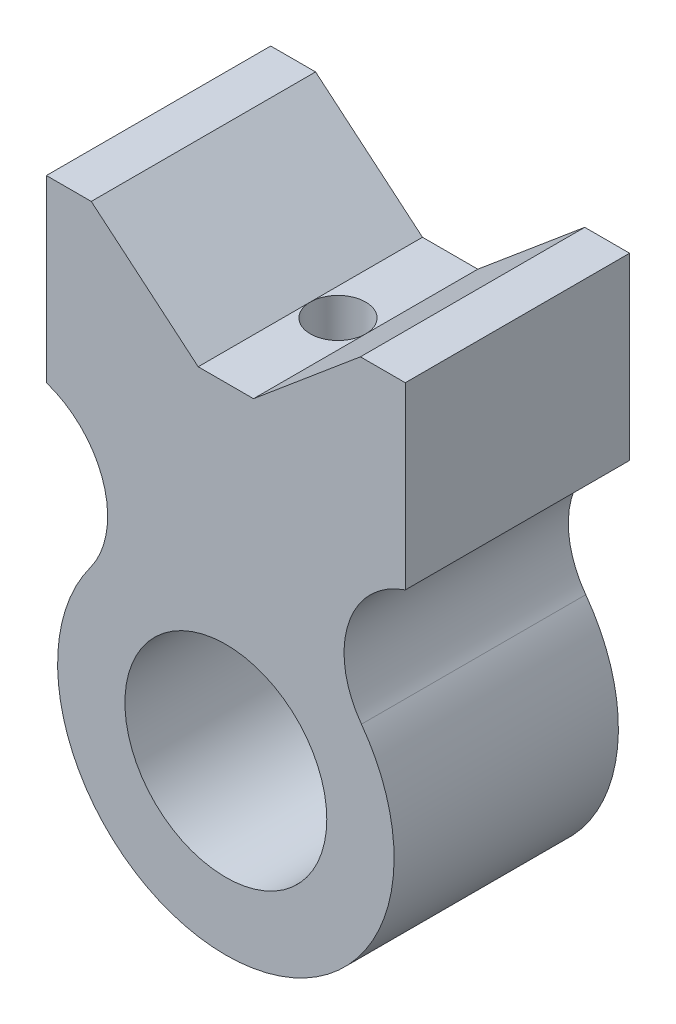
ISO-10303-21;
HEADER;
FILE_DESCRIPTION(('STEP AP214'),'2;1');
FILE_NAME('part.step','',(''),(''),'','','');
FILE_SCHEMA(('AUTOMOTIVE_DESIGN { 1 0 10303 214 1 1 1 1 }'));
ENDSEC;
DATA;
#1=APPLICATION_CONTEXT('core data for automotive mechanical design processes');
#2=APPLICATION_PROTOCOL_DEFINITION('international standard','automotive_design',2000,#1);
#3=PRODUCT_CONTEXT('',#1,'mechanical');
#4=PRODUCT('Part','Part','',(#3));
#5=PRODUCT_RELATED_PRODUCT_CATEGORY('part','',(#4));
#6=PRODUCT_DEFINITION_FORMATION('','',#4);
#7=PRODUCT_DEFINITION_CONTEXT('part definition',#1,'design');
#8=PRODUCT_DEFINITION('design','',#6,#7);
#9=PRODUCT_DEFINITION_SHAPE('','',#8);
#10=(LENGTH_UNIT() NAMED_UNIT(*) SI_UNIT(.MILLI.,.METRE.));
#11=(NAMED_UNIT(*) PLANE_ANGLE_UNIT() SI_UNIT($,.RADIAN.));
#12=(NAMED_UNIT(*) SI_UNIT($,.STERADIAN.) SOLID_ANGLE_UNIT());
#13=UNCERTAINTY_MEASURE_WITH_UNIT(LENGTH_MEASURE(1.E-05),#10,'distance_accuracy_value','');
#14=(GEOMETRIC_REPRESENTATION_CONTEXT(3) GLOBAL_UNCERTAINTY_ASSIGNED_CONTEXT((#13)) GLOBAL_UNIT_ASSIGNED_CONTEXT((#10,
#11,#12)) REPRESENTATION_CONTEXT('',''));
#15=CARTESIAN_POINT('',(0.,0.,0.));
#16=DIRECTION('',(0.,0.,1.));
#17=DIRECTION('',(1.,0.,0.));
#18=AXIS2_PLACEMENT_3D('',#15,#16,#17);
#19=CARTESIAN_POINT('',(-6.16492814811606,73.,-25.));
#20=DIRECTION('',(0.,1.,0.));
#21=DIRECTION('',(0.,0.,1.));
#22=AXIS2_PLACEMENT_3D('',#19,#20,#21);
#23=PLANE('',#22);
#24=CARTESIAN_POINT('',(0.,73.,0.));
#25=DIRECTION('',(0.,1.,0.));
#26=DIRECTION('',(0.,0.,1.));
#27=AXIS2_PLACEMENT_3D('',#24,#25,#26);
#28=CIRCLE('',#27,6.16492814811606);
#29=CARTESIAN_POINT('',(6.16492814811606,73.,0.));
#30=VERTEX_POINT('',#29);
#31=CARTESIAN_POINT('',(-6.16492814811606,73.,0.));
#32=VERTEX_POINT('',#31);
#33=EDGE_CURVE('E62',#30,#32,#28,.T.);
#34=ORIENTED_EDGE('',*,*,#33,.F.);
#35=DIRECTION('',(0.,0.,1.));
#36=VECTOR('',#35,1.);
#37=CARTESIAN_POINT('',(6.16492814811606,73.,-25.));
#38=LINE('',#37,#36);
#39=CARTESIAN_POINT('',(6.16492814811606,73.,-25.));
#40=VERTEX_POINT('',#39);
#41=EDGE_CURVE('E140',#40,#30,#38,.T.);
#42=ORIENTED_EDGE('',*,*,#41,.F.);
#43=DIRECTION('',(-1.,0.,0.));
#44=VECTOR('',#43,1.);
#45=CARTESIAN_POINT('',(-6.16492814811606,73.,-25.));
#46=LINE('',#45,#44);
#47=CARTESIAN_POINT('',(-6.16492814811606,73.,-25.));
#48=VERTEX_POINT('',#47);
#49=EDGE_CURVE('E249',#40,#48,#46,.T.);
#50=ORIENTED_EDGE('',*,*,#49,.T.);
#51=DIRECTION('',(0.,0.,1.));
#52=VECTOR('',#51,1.);
#53=CARTESIAN_POINT('',(-6.16492814811606,73.,-25.));
#54=LINE('',#53,#52);
#55=EDGE_CURVE('E142',#48,#32,#54,.T.);
#56=ORIENTED_EDGE('',*,*,#55,.T.);
#57=EDGE_LOOP('',(#34,#42,#50,#56));
#58=FACE_BOUND('',#57,.T.);
#59=ADVANCED_FACE('F45',(#58),#23,.T.);
#60=CARTESIAN_POINT('',(-46.3461684635963,34.0335521029462,-25.));
#61=DIRECTION('',(0.,0.,1.));
#62=DIRECTION('',(1.,0.,0.));
#63=AXIS2_PLACEMENT_3D('',#60,#61,#62);
#64=CYLINDRICAL_SURFACE('',#63,20.);
#65=DIRECTION('',(0.,0.,1.));
#66=VECTOR('',#65,1.);
#67=CARTESIAN_POINT('',(-30.2257620414758,22.1957948497475,-25.));
#68=LINE('',#67,#66);
#69=CARTESIAN_POINT('',(-30.2257620414758,22.1957948497475,-25.));
#70=VERTEX_POINT('',#69);
#71=CARTESIAN_POINT('',(-30.2257620414758,22.1957948497475,25.));
#72=VERTEX_POINT('',#71);
#73=EDGE_CURVE('E49',#70,#72,#68,.T.);
#74=ORIENTED_EDGE('',*,*,#73,.T.);
#75=CARTESIAN_POINT('',(-46.3461684635963,34.0335521029462,25.));
#76=DIRECTION('',(0.,0.,-1.));
#77=DIRECTION('',(1.,0.,0.));
#78=AXIS2_PLACEMENT_3D('',#75,#76,#77);
#79=CIRCLE('',#78,20.);
#80=CARTESIAN_POINT('',(-40.,53.,25.));
#81=VERTEX_POINT('',#80);
#82=EDGE_CURVE('E304',#81,#72,#79,.T.);
#83=ORIENTED_EDGE('',*,*,#82,.F.);
#84=DIRECTION('',(0.,0.,1.));
#85=VECTOR('',#84,1.);
#86=CARTESIAN_POINT('',(-40.,53.,-25.));
#87=LINE('',#86,#85);
#88=CARTESIAN_POINT('',(-40.,53.,-25.));
#89=VERTEX_POINT('',#88);
#90=EDGE_CURVE('E11',#89,#81,#87,.T.);
#91=ORIENTED_EDGE('',*,*,#90,.F.);
#92=CARTESIAN_POINT('',(-46.3461684635963,34.0335521029462,-25.));
#93=DIRECTION('',(0.,0.,-1.));
#94=DIRECTION('',(1.,0.,0.));
#95=AXIS2_PLACEMENT_3D('',#92,#93,#94);
#96=CIRCLE('',#95,20.);
#97=EDGE_CURVE('E229',#89,#70,#96,.T.);
#98=ORIENTED_EDGE('',*,*,#97,.T.);
#99=EDGE_LOOP('',(#74,#83,#91,#98));
#100=FACE_BOUND('',#99,.T.);
#101=ADVANCED_FACE('F47',(#100),#64,.F.);
#102=CARTESIAN_POINT('',(-40.,53.,-25.));
#103=DIRECTION('',(-1.,0.,0.));
#104=DIRECTION('',(0.,-1.,0.));
#105=AXIS2_PLACEMENT_3D('',#102,#103,#104);
#106=PLANE('',#105);
#107=ORIENTED_EDGE('',*,*,#90,.T.);
#108=DIRECTION('',(0.,-1.,0.));
#109=VECTOR('',#108,1.);
#110=CARTESIAN_POINT('',(-40.,53.,25.));
#111=LINE('',#110,#109);
#112=CARTESIAN_POINT('',(-40.,93.,25.));
#113=VERTEX_POINT('',#112);
#114=EDGE_CURVE('E219',#113,#81,#111,.T.);
#115=ORIENTED_EDGE('',*,*,#114,.F.);
#116=DIRECTION('',(0.,0.,1.));
#117=VECTOR('',#116,1.);
#118=CARTESIAN_POINT('',(-40.,93.,-25.));
#119=LINE('',#118,#117);
#120=CARTESIAN_POINT('',(-40.,93.,-25.));
#121=VERTEX_POINT('',#120);
#122=EDGE_CURVE('E55',#121,#113,#119,.T.);
#123=ORIENTED_EDGE('',*,*,#122,.F.);
#124=DIRECTION('',(0.,-1.,0.));
#125=VECTOR('',#124,1.);
#126=CARTESIAN_POINT('',(-40.,53.,-25.));
#127=LINE('',#126,#125);
#128=EDGE_CURVE('E180',#121,#89,#127,.T.);
#129=ORIENTED_EDGE('',*,*,#128,.T.);
#130=EDGE_LOOP('',(#107,#115,#123,#129));
#131=FACE_BOUND('',#130,.T.);
#132=ADVANCED_FACE('F258',(#131),#106,.T.);
#133=CARTESIAN_POINT('',(-40.,93.,-25.));
#134=DIRECTION('',(0.,1.,0.));
#135=DIRECTION('',(0.,0.,1.));
#136=AXIS2_PLACEMENT_3D('',#133,#134,#135);
#137=PLANE('',#136);
#138=ORIENTED_EDGE('',*,*,#122,.T.);
#139=DIRECTION('',(-1.,0.,0.));
#140=VECTOR('',#139,1.);
#141=CARTESIAN_POINT('',(-40.,93.,25.));
#142=LINE('',#141,#140);
#143=CARTESIAN_POINT('',(-30.,93.,25.));
#144=VERTEX_POINT('',#143);
#145=EDGE_CURVE('E213',#144,#113,#142,.T.);
#146=ORIENTED_EDGE('',*,*,#145,.F.);
#147=DIRECTION('',(0.,0.,1.));
#148=VECTOR('',#147,1.);
#149=CARTESIAN_POINT('',(-30.,93.,-25.));
#150=LINE('',#149,#148);
#151=CARTESIAN_POINT('',(-30.,93.,-25.));
#152=VERTEX_POINT('',#151);
#153=EDGE_CURVE('E194',#152,#144,#150,.T.);
#154=ORIENTED_EDGE('',*,*,#153,.F.);
#155=DIRECTION('',(-1.,0.,0.));
#156=VECTOR('',#155,1.);
#157=CARTESIAN_POINT('',(-40.,93.,-25.));
#158=LINE('',#157,#156);
#159=EDGE_CURVE('E183',#152,#121,#158,.T.);
#160=ORIENTED_EDGE('',*,*,#159,.T.);
#161=EDGE_LOOP('',(#138,#146,#154,#160));
#162=FACE_BOUND('',#161,.T.);
#163=ADVANCED_FACE('F217',(#162),#137,.T.);
#164=CARTESIAN_POINT('',(-30.,93.,-25.));
#165=DIRECTION('',(0.642787609686544,0.766044443118974,0.));
#166=DIRECTION('',(-0.766044443118974,0.642787609686544,0.));
#167=AXIS2_PLACEMENT_3D('',#164,#165,#166);
#168=PLANE('',#167);
#169=ORIENTED_EDGE('',*,*,#153,.T.);
#170=DIRECTION('',(-0.766044443118974,0.642787609686543,0.));
#171=VECTOR('',#170,1.);
#172=CARTESIAN_POINT('',(-30.,93.,25.));
#173=LINE('',#172,#171);
#174=CARTESIAN_POINT('',(-6.16492814811606,73.,25.));
#175=VERTEX_POINT('',#174);
#176=EDGE_CURVE('E202',#175,#144,#173,.T.);
#177=ORIENTED_EDGE('',*,*,#176,.F.);
#178=EDGE_CURVE('E161',#32,#175,#54,.T.);
#179=ORIENTED_EDGE('',*,*,#178,.F.);
#180=ORIENTED_EDGE('',*,*,#55,.F.);
#181=DIRECTION('',(-0.766044443118974,0.642787609686543,0.));
#182=VECTOR('',#181,1.);
#183=CARTESIAN_POINT('',(-30.,93.,-25.));
#184=LINE('',#183,#182);
#185=EDGE_CURVE('E189',#48,#152,#184,.T.);
#186=ORIENTED_EDGE('',*,*,#185,.T.);
#187=EDGE_LOOP('',(#169,#177,#179,#180,#186));
#188=FACE_BOUND('',#187,.T.);
#189=ADVANCED_FACE('F201',(#188),#168,.T.);
#190=EDGE_CURVE('E127',#32,#30,#28,.T.);
#191=ORIENTED_EDGE('',*,*,#190,.F.);
#192=ORIENTED_EDGE('',*,*,#178,.T.);
#193=DIRECTION('',(-1.,0.,0.));
#194=VECTOR('',#193,1.);
#195=CARTESIAN_POINT('',(-6.16492814811606,73.,25.));
#196=LINE('',#195,#194);
#197=CARTESIAN_POINT('',(6.16492814811606,73.,25.));
#198=VERTEX_POINT('',#197);
#199=EDGE_CURVE('E149',#198,#175,#196,.T.);
#200=ORIENTED_EDGE('',*,*,#199,.F.);
#201=EDGE_CURVE('E146',#30,#198,#38,.T.);
#202=ORIENTED_EDGE('',*,*,#201,.F.);
#203=EDGE_LOOP('',(#191,#192,#200,#202));
#204=FACE_BOUND('',#203,.T.);
#205=ADVANCED_FACE('F147',(#204),#23,.T.);
#206=CARTESIAN_POINT('',(30.,93.,-25.));
#207=DIRECTION('',(-0.642787609686543,0.766044443118975,0.));
#208=DIRECTION('',(-0.766044443118975,-0.642787609686543,0.));
#209=AXIS2_PLACEMENT_3D('',#206,#207,#208);
#210=PLANE('',#209);
#211=ORIENTED_EDGE('',*,*,#41,.T.);
#212=ORIENTED_EDGE('',*,*,#201,.T.);
#213=DIRECTION('',(-0.766044443118975,-0.642787609686543,0.));
#214=VECTOR('',#213,1.);
#215=CARTESIAN_POINT('',(30.,93.,25.));
#216=LINE('',#215,#214);
#217=CARTESIAN_POINT('',(30.,93.,25.));
#218=VERTEX_POINT('',#217);
#219=EDGE_CURVE('E322',#218,#198,#216,.T.);
#220=ORIENTED_EDGE('',*,*,#219,.F.);
#221=DIRECTION('',(0.,0.,1.));
#222=VECTOR('',#221,1.);
#223=CARTESIAN_POINT('',(30.,93.,-25.));
#224=LINE('',#223,#222);
#225=CARTESIAN_POINT('',(30.,93.,-25.));
#226=VERTEX_POINT('',#225);
#227=EDGE_CURVE('E154',#226,#218,#224,.T.);
#228=ORIENTED_EDGE('',*,*,#227,.F.);
#229=DIRECTION('',(-0.766044443118975,-0.642787609686543,0.));
#230=VECTOR('',#229,1.);
#231=CARTESIAN_POINT('',(30.,93.,-25.));
#232=LINE('',#231,#230);
#233=EDGE_CURVE('E159',#226,#40,#232,.T.);
#234=ORIENTED_EDGE('',*,*,#233,.T.);
#235=EDGE_LOOP('',(#211,#212,#220,#228,#234));
#236=FACE_BOUND('',#235,.T.);
#237=ADVANCED_FACE('F157',(#236),#210,.T.);
#238=CARTESIAN_POINT('',(40.,93.,-25.));
#239=DIRECTION('',(0.,1.,0.));
#240=DIRECTION('',(0.,0.,1.));
#241=AXIS2_PLACEMENT_3D('',#238,#239,#240);
#242=PLANE('',#241);
#243=ORIENTED_EDGE('',*,*,#227,.T.);
#244=DIRECTION('',(-1.,0.,0.));
#245=VECTOR('',#244,1.);
#246=CARTESIAN_POINT('',(40.,93.,25.));
#247=LINE('',#246,#245);
#248=CARTESIAN_POINT('',(40.,93.,25.));
#249=VERTEX_POINT('',#248);
#250=EDGE_CURVE('E318',#249,#218,#247,.T.);
#251=ORIENTED_EDGE('',*,*,#250,.F.);
#252=DIRECTION('',(0.,0.,1.));
#253=VECTOR('',#252,1.);
#254=CARTESIAN_POINT('',(40.,93.,-25.));
#255=LINE('',#254,#253);
#256=CARTESIAN_POINT('',(40.,93.,-25.));
#257=VERTEX_POINT('',#256);
#258=EDGE_CURVE('E168',#257,#249,#255,.T.);
#259=ORIENTED_EDGE('',*,*,#258,.F.);
#260=DIRECTION('',(-1.,0.,0.));
#261=VECTOR('',#260,1.);
#262=CARTESIAN_POINT('',(40.,93.,-25.));
#263=LINE('',#262,#261);
#264=EDGE_CURVE('E243',#257,#226,#263,.T.);
#265=ORIENTED_EDGE('',*,*,#264,.T.);
#266=EDGE_LOOP('',(#243,#251,#259,#265));
#267=FACE_BOUND('',#266,.T.);
#268=ADVANCED_FACE('F275',(#267),#242,.T.);
#269=CARTESIAN_POINT('',(40.,53.,-25.));
#270=DIRECTION('',(1.,0.,0.));
#271=DIRECTION('',(0.,1.,0.));
#272=AXIS2_PLACEMENT_3D('',#269,#270,#271);
#273=PLANE('',#272);
#274=ORIENTED_EDGE('',*,*,#258,.T.);
#275=DIRECTION('',(0.,1.,0.));
#276=VECTOR('',#275,1.);
#277=CARTESIAN_POINT('',(40.,53.,25.));
#278=LINE('',#277,#276);
#279=CARTESIAN_POINT('',(40.,53.,25.));
#280=VERTEX_POINT('',#279);
#281=EDGE_CURVE('E314',#280,#249,#278,.T.);
#282=ORIENTED_EDGE('',*,*,#281,.F.);
#283=DIRECTION('',(0.,0.,1.));
#284=VECTOR('',#283,1.);
#285=CARTESIAN_POINT('',(40.,53.,-25.));
#286=LINE('',#285,#284);
#287=CARTESIAN_POINT('',(40.,53.,-25.));
#288=VERTEX_POINT('',#287);
#289=EDGE_CURVE('E171',#288,#280,#286,.T.);
#290=ORIENTED_EDGE('',*,*,#289,.F.);
#291=DIRECTION('',(0.,1.,0.));
#292=VECTOR('',#291,1.);
#293=CARTESIAN_POINT('',(40.,53.,-25.));
#294=LINE('',#293,#292);
#295=EDGE_CURVE('E239',#288,#257,#294,.T.);
#296=ORIENTED_EDGE('',*,*,#295,.T.);
#297=EDGE_LOOP('',(#274,#282,#290,#296));
#298=FACE_BOUND('',#297,.T.);
#299=ADVANCED_FACE('F329',(#298),#273,.T.);
#300=CARTESIAN_POINT('',(46.3461684635963,34.0335521029462,-25.));
#301=DIRECTION('',(0.,0.,1.));
#302=DIRECTION('',(1.,0.,0.));
#303=AXIS2_PLACEMENT_3D('',#300,#301,#302);
#304=CYLINDRICAL_SURFACE('',#303,20.);
#305=ORIENTED_EDGE('',*,*,#289,.T.);
#306=CARTESIAN_POINT('',(46.3461684635963,34.0335521029462,25.));
#307=DIRECTION('',(0.,0.,-1.));
#308=DIRECTION('',(-1.,0.,0.));
#309=AXIS2_PLACEMENT_3D('',#306,#307,#308);
#310=CIRCLE('',#309,20.);
#311=CARTESIAN_POINT('',(30.2257620414758,22.1957948497475,25.));
#312=VERTEX_POINT('',#311);
#313=EDGE_CURVE('E310',#312,#280,#310,.T.);
#314=ORIENTED_EDGE('',*,*,#313,.F.);
#315=DIRECTION('',(0.,0.,1.));
#316=VECTOR('',#315,1.);
#317=CARTESIAN_POINT('',(30.2257620414758,22.1957948497475,-25.));
#318=LINE('',#317,#316);
#319=CARTESIAN_POINT('',(30.2257620414758,22.1957948497475,-25.));
#320=VERTEX_POINT('',#319);
#321=EDGE_CURVE('E173',#320,#312,#318,.T.);
#322=ORIENTED_EDGE('',*,*,#321,.F.);
#323=CARTESIAN_POINT('',(46.3461684635963,34.0335521029462,-25.));
#324=DIRECTION('',(0.,0.,-1.));
#325=DIRECTION('',(-1.,0.,0.));
#326=AXIS2_PLACEMENT_3D('',#323,#324,#325);
#327=CIRCLE('',#326,20.);
#328=EDGE_CURVE('E235',#320,#288,#327,.T.);
#329=ORIENTED_EDGE('',*,*,#328,.T.);
#330=EDGE_LOOP('',(#305,#314,#322,#329));
#331=FACE_BOUND('',#330,.T.);
#332=ADVANCED_FACE('F333',(#331),#304,.F.);
#333=CARTESIAN_POINT('',(0.,0.,-25.));
#334=DIRECTION('',(0.,0.,1.));
#335=DIRECTION('',(1.,0.,0.));
#336=AXIS2_PLACEMENT_3D('',#333,#334,#335);
#337=CYLINDRICAL_SURFACE('',#336,37.5);
#338=ORIENTED_EDGE('',*,*,#321,.T.);
#339=CARTESIAN_POINT('',(0.,0.,25.));
#340=DIRECTION('',(0.,0.,1.));
#341=DIRECTION('',(1.,0.,0.));
#342=AXIS2_PLACEMENT_3D('',#339,#340,#341);
#343=CIRCLE('',#342,37.5);
#344=EDGE_CURVE('E307',#72,#312,#343,.T.);
#345=ORIENTED_EDGE('',*,*,#344,.F.);
#346=ORIENTED_EDGE('',*,*,#73,.F.);
#347=CARTESIAN_POINT('',(0.,0.,-25.));
#348=DIRECTION('',(0.,0.,1.));
#349=DIRECTION('',(1.,0.,0.));
#350=AXIS2_PLACEMENT_3D('',#347,#348,#349);
#351=CIRCLE('',#350,37.5);
#352=EDGE_CURVE('E232',#70,#320,#351,.T.);
#353=ORIENTED_EDGE('',*,*,#352,.T.);
#354=EDGE_LOOP('',(#338,#345,#346,#353));
#355=FACE_BOUND('',#354,.T.);
#356=ADVANCED_FACE('F284',(#355),#337,.T.);
#357=CARTESIAN_POINT('',(-46.3461684635963,34.0335521029462,-25.));
#358=DIRECTION('',(0.,0.,1.));
#359=DIRECTION('',(1.,0.,0.));
#360=AXIS2_PLACEMENT_3D('',#357,#358,#359);
#361=PLANE('',#360);
#362=CARTESIAN_POINT('',(0.,0.,-25.));
#363=DIRECTION('',(0.,0.,1.));
#364=DIRECTION('',(1.,0.,0.));
#365=AXIS2_PLACEMENT_3D('',#362,#363,#364);
#366=CIRCLE('',#365,22.5);
#367=CARTESIAN_POINT('',(22.5,0.,-25.));
#368=VERTEX_POINT('',#367);
#369=EDGE_CURVE('E222',#368,#368,#366,.T.);
#370=ORIENTED_EDGE('',*,*,#369,.T.);
#371=EDGE_LOOP('',(#370));
#372=FACE_BOUND('',#371,.T.);
#373=ORIENTED_EDGE('',*,*,#97,.F.);
#374=ORIENTED_EDGE('',*,*,#128,.F.);
#375=ORIENTED_EDGE('',*,*,#159,.F.);
#376=ORIENTED_EDGE('',*,*,#185,.F.);
#377=ORIENTED_EDGE('',*,*,#49,.F.);
#378=ORIENTED_EDGE('',*,*,#233,.F.);
#379=ORIENTED_EDGE('',*,*,#264,.F.);
#380=ORIENTED_EDGE('',*,*,#295,.F.);
#381=ORIENTED_EDGE('',*,*,#328,.F.);
#382=ORIENTED_EDGE('',*,*,#352,.F.);
#383=EDGE_LOOP('',(#373,#374,#375,#376,#377,#378,#379,#380,#381,#382));
#384=FACE_BOUND('',#383,.T.);
#385=ADVANCED_FACE('F253',(#372,#384),#361,.F.);
#386=CARTESIAN_POINT('',(0.,0.,-25.));
#387=DIRECTION('',(0.,0.,1.));
#388=DIRECTION('',(1.,0.,0.));
#389=AXIS2_PLACEMENT_3D('',#386,#387,#388);
#390=CYLINDRICAL_SURFACE('',#389,22.5);
#391=CARTESIAN_POINT('',(0.,22.5,6.16492814811606));
#392=CARTESIAN_POINT('',(-0.169806582882264,22.5000039960642,6.16493432537604));
#393=CARTESIAN_POINT('',(-0.33955022694007,22.4980751444653,6.15791187330995));
#394=CARTESIAN_POINT('',(-0.677841259787064,22.4904224360659,6.12989797400223));
#395=CARTESIAN_POINT('',(-0.846388548099947,22.4846982642383,6.10890536717985));
#396=CARTESIAN_POINT('',(-1.18104165418468,22.4696066108682,6.05312090589061));
#397=CARTESIAN_POINT('',(-1.3471469820895,22.4602384083951,6.01832632083066));
#398=CARTESIAN_POINT('',(-1.67577546460624,22.4381127849741,5.93522110949801));
#399=CARTESIAN_POINT('',(-1.83829727315902,22.425354113201,5.8869054946444));
#400=CARTESIAN_POINT('',(-2.15829488030962,22.3968195425099,5.77725360608043));
#401=CARTESIAN_POINT('',(-2.31577891146127,22.3810488943218,5.71593997144519));
#402=CARTESIAN_POINT('',(-2.62500320144759,22.3468917258441,5.58069795342471));
#403=CARTESIAN_POINT('',(-2.77674131120778,22.3285042388103,5.50676490600213));
#404=CARTESIAN_POINT('',(-3.07339712724509,22.2896073333311,5.3468628997945));
#405=CARTESIAN_POINT('',(-3.21831702463013,22.2690986034412,5.26089784341945));
#406=CARTESIAN_POINT('',(-3.50050229745757,22.2264906942456,5.07751708496835));
#407=CARTESIAN_POINT('',(-3.63776471458466,22.2043909077161,4.98009700202479));
#408=CARTESIAN_POINT('',(-4.04246948944531,22.1355862444801,4.66717733206199));
#409=CARTESIAN_POINT('',(-4.29656770180822,22.0872321064045,4.43439071819045));
#410=CARTESIAN_POINT('',(-4.76259441925964,21.9914654895211,3.92963570163445));
#411=CARTESIAN_POINT('',(-4.97451716889656,21.9440531400276,3.65766196001851));
#412=CARTESIAN_POINT('',(-5.25815790782864,21.8771899570339,3.22317848020177));
#413=CARTESIAN_POINT('',(-5.34767334201774,21.85542723333,3.07237935741095));
#414=CARTESIAN_POINT('',(-5.51363533208247,21.8141499788044,2.76348649124076));
#415=CARTESIAN_POINT('',(-5.59008701408887,21.7946345671369,2.60539564015495));
#416=CARTESIAN_POINT('',(-5.729336957187,21.7584438655222,2.28295758478966));
#417=CARTESIAN_POINT('',(-5.79213179690379,21.7417692874998,2.11860882484008));
#418=CARTESIAN_POINT('',(-5.90349690158619,21.7117952308473,1.78493131760135));
#419=CARTESIAN_POINT('',(-5.9520732163491,21.6984943170894,1.61560472216287));
#420=CARTESIAN_POINT('',(-6.03363481814373,21.6759544268942,1.27717526156714));
#421=CARTESIAN_POINT('',(-6.0669578399778,21.6666278124779,1.10815959059889));
#422=CARTESIAN_POINT('',(-6.11934690513446,21.6518898983504,0.767828935790912));
#423=CARTESIAN_POINT('',(-6.1384185662097,21.6464770558944,0.596514885088023));
#424=CARTESIAN_POINT('',(-6.16215080093002,21.6397331413984,0.25280809820122));
#425=CARTESIAN_POINT('',(-6.1668111224244,21.6384021407771,0.0804153431964339));
#426=CARTESIAN_POINT('',(-6.16167634266507,21.6398648858207,-0.264135535095239));
#427=CARTESIAN_POINT('',(-6.15188149115298,21.6426585602237,-0.436293662384347));
#428=CARTESIAN_POINT('',(-6.11843502124639,21.6521371224712,-0.773960504266763));
#429=CARTESIAN_POINT('',(-6.09520493715009,21.6587035981165,-0.939514511948451));
#430=CARTESIAN_POINT('',(-6.03541443964941,21.6754408325643,-1.26807010115716));
#431=CARTESIAN_POINT('',(-5.99884947014614,21.6856128232212,-1.43107079042193));
#432=CARTESIAN_POINT('',(-5.9127068407739,21.7092581439077,-1.75329453714324));
#433=CARTESIAN_POINT('',(-5.8631331451133,21.7227304681287,-1.91251872933888));
#434=CARTESIAN_POINT('',(-5.75133986147468,21.7525960606148,-2.22624594985452));
#435=CARTESIAN_POINT('',(-5.68911550205111,21.7689904306982,-2.38074717144546));
#436=CARTESIAN_POINT('',(-5.55171884641225,21.8044377535922,-2.6857114586428));
#437=CARTESIAN_POINT('',(-5.47640679840819,21.8235189296057,-2.83610825807759));
#438=CARTESIAN_POINT('',(-5.31385276963517,21.8636679614617,-3.13010115365403));
#439=CARTESIAN_POINT('',(-5.2266064321382,21.8847365419496,-3.27369474032337));
#440=CARTESIAN_POINT('',(-5.04081979674815,21.9282747522514,-3.5531138054884));
#441=CARTESIAN_POINT('',(-4.94228159419797,21.9507441217802,-3.6889407181955));
#442=CARTESIAN_POINT('',(-4.73450254944399,21.9964952527017,-3.95208047847492));
#443=CARTESIAN_POINT('',(-4.62525769442764,22.0197773165682,-4.07939010348808));
#444=CARTESIAN_POINT('',(-4.39287067890089,22.0673339092767,-4.32886474845523));
#445=CARTESIAN_POINT('',(-4.26938109461612,22.0916151568993,-4.45070510382744));
#446=CARTESIAN_POINT('',(-4.01247841598793,22.1397176632581,-4.68363446382164));
#447=CARTESIAN_POINT('',(-3.87906159137716,22.1635387448036,-4.79471939052602));
#448=CARTESIAN_POINT('',(-3.60325208425433,22.2100455377254,-5.00529787215663));
#449=CARTESIAN_POINT('',(-3.46086218934254,22.23273159782,-5.10479499989115));
#450=CARTESIAN_POINT('',(-3.16794657858059,22.2763561744455,-5.29156256454571));
#451=CARTESIAN_POINT('',(-3.0174179187304,22.2972940515513,-5.37882853558179));
#452=CARTESIAN_POINT('',(-2.70855918561452,22.3369213743167,-5.54081171172734));
#453=CARTESIAN_POINT('',(-2.55019605520404,22.3555998985362,-5.6154686043176));
#454=CARTESIAN_POINT('',(-2.2274220744048,22.3900631874975,-5.75113692650811));
#455=CARTESIAN_POINT('',(-2.06301125822013,22.4058479686026,-5.8121484332692));
#456=CARTESIAN_POINT('',(-1.72935730160547,22.4340666247422,-5.91999957955575));
#457=CARTESIAN_POINT('',(-1.56011509846197,22.4465011449052,-5.96684194771275));
#458=CARTESIAN_POINT('',(-1.218027605835,22.4676605762573,-6.04595453771613));
#459=CARTESIAN_POINT('',(-1.04518234436069,22.4763855162725,-6.07822487279716));
#460=CARTESIAN_POINT('',(-0.702507567331866,22.4896639855157,-6.12714135233718));
#461=CARTESIAN_POINT('',(-0.532746070506524,22.4943362433066,-6.14423257762602));
#462=CARTESIAN_POINT('',(-0.192329551071779,22.4998218813114,-6.16428567717589));
#463=CARTESIAN_POINT('',(-0.0216745462589148,22.5006353380929,-6.1672478317905));
#464=CARTESIAN_POINT('',(0.319251749170181,22.4983807379122,-6.1590169752856));
#465=CARTESIAN_POINT('',(0.489523072866962,22.4953130294945,-6.14782523524338));
#466=CARTESIAN_POINT('',(0.828438657616993,22.4853825729193,-6.11138897949119));
#467=CARTESIAN_POINT('',(0.997082961163792,22.4785199241505,-6.08614483180999));
#468=CARTESIAN_POINT('',(1.32845504952245,22.461349704142,-6.02241573150447));
#469=CARTESIAN_POINT('',(1.4912346230863,22.4511075620972,-5.98418188024653));
#470=CARTESIAN_POINT('',(1.81293475413386,22.4274225467095,-5.89469942282163));
#471=CARTESIAN_POINT('',(1.97185533240755,22.4139796906145,-5.84345088678716));
#472=CARTESIAN_POINT('',(2.28482175693817,22.3842423742803,-5.72832756103781));
#473=CARTESIAN_POINT('',(2.438866389126,22.3679472103344,-5.66444965496431));
#474=CARTESIAN_POINT('',(2.74100123368833,22.3329361300493,-5.5245774563585));
#475=CARTESIAN_POINT('',(2.88909335619826,22.3142209985296,-5.44858709016579));
#476=CARTESIAN_POINT('',(3.18145867936264,22.2744368329442,-5.28331703387197));
#477=CARTESIAN_POINT('',(3.32558906948809,22.2533270443177,-5.19379450734877));
#478=CARTESIAN_POINT('',(3.60578745782322,22.2096465341185,-5.00333134872546));
#479=CARTESIAN_POINT('',(3.7418581036202,22.1870762974512,-4.90239449822972));
#480=CARTESIAN_POINT('',(4.0052177249965,22.1410503957155,-4.68969455471226));
#481=CARTESIAN_POINT('',(4.13250198733892,22.1175942657095,-4.57792572724231));
#482=CARTESIAN_POINT('',(4.37737913654636,22.0704349193249,-4.3443654328644));
#483=CARTESIAN_POINT('',(4.49497532548857,22.0467317902622,-4.22257740941608));
#484=CARTESIAN_POINT('',(4.72320026349607,21.9989859483324,-3.96586696674587));
#485=CARTESIAN_POINT('',(4.83350970398813,21.9749547256832,-3.83065829332807));
#486=CARTESIAN_POINT('',(5.04231616244148,21.9279843952496,-3.55130755226217));
#487=CARTESIAN_POINT('',(5.14081745403814,21.9050448941702,-3.40716874545366));
#488=CARTESIAN_POINT('',(5.3253842188102,21.8609078841912,-3.11080477647743));
#489=CARTESIAN_POINT('',(5.41144504123835,21.8397110280328,-2.9585766191209));
#490=CARTESIAN_POINT('',(5.57040209053215,21.7997096094534,-2.64716952801538));
#491=CARTESIAN_POINT('',(5.64330367033686,21.7809040752107,-2.48799345342193));
#492=CARTESIAN_POINT('',(5.77504746569222,21.7463432237566,-2.16459878047936));
#493=CARTESIAN_POINT('',(5.83396235685018,21.7305722238454,-2.00041148456061));
#494=CARTESIAN_POINT('',(5.93771165322653,21.7024531255725,-1.66742811008222));
#495=CARTESIAN_POINT('',(5.98255157466722,21.6901036864657,-1.49863386532762));
#496=CARTESIAN_POINT('',(6.05778203128455,21.6692132668398,-1.15762721807247));
#497=CARTESIAN_POINT('',(6.08817304683312,21.6606721597085,-0.985414929407398));
#498=CARTESIAN_POINT('',(6.13422524676834,21.6476755339498,-0.638880683604524));
#499=CARTESIAN_POINT('',(6.149886876088,21.6432198919122,-0.464558790353026));
#500=CARTESIAN_POINT('',(6.16604647060492,21.6386214053654,-0.12125612360965));
#501=CARTESIAN_POINT('',(6.1670541752404,21.6383335839847,0.047698921337848));
#502=CARTESIAN_POINT('',(6.15520232617341,21.6417079446375,0.385141697966576));
#503=CARTESIAN_POINT('',(6.14233800910943,21.6453714834853,0.553629249197071));
#504=CARTESIAN_POINT('',(6.10285680929582,21.6565361403234,0.888785444564709));
#505=CARTESIAN_POINT('',(6.07624546535875,21.6640357127259,1.05545479367746));
#506=CARTESIAN_POINT('',(6.00949204258977,21.6826475386282,1.38591883174346));
#507=CARTESIAN_POINT('',(5.96934491938274,21.6937611389119,1.54971242501279));
#508=CARTESIAN_POINT('',(5.87628064869485,21.7191534736324,1.87176583194811));
#509=CARTESIAN_POINT('',(5.82348185784216,21.7334027781401,2.03006221575749));
#510=CARTESIAN_POINT('',(5.7053231724734,21.7647196477253,2.34166637399161));
#511=CARTESIAN_POINT('',(5.63995900342803,21.7817881715744,2.49497242997915));
#512=CARTESIAN_POINT('',(5.49716992069159,21.8182618218053,2.79555831973861));
#513=CARTESIAN_POINT('',(5.41974563696094,21.8376668261288,2.94283846776689));
#514=CARTESIAN_POINT('',(5.25337447137081,21.8782857216185,3.23048020528008));
#515=CARTESIAN_POINT('',(5.16442720921846,21.8994996724775,3.3708415662131));
#516=CARTESIAN_POINT('',(4.97266048230379,21.9438517278869,3.64804980042763));
#517=CARTESIAN_POINT('',(4.8694955372525,21.9670291614669,3.78465148871032));
#518=CARTESIAN_POINT('',(4.65226950223889,22.014057575195,4.04869688988838));
#519=CARTESIAN_POINT('',(4.53821181169798,22.0379083435818,4.17614343831618));
#520=CARTESIAN_POINT('',(4.29983997657932,22.0856549824754,4.42119317731532));
#521=CARTESIAN_POINT('',(4.17551990718833,22.109550871143,4.5387906016163));
#522=CARTESIAN_POINT('',(3.91751660991886,22.1567202609231,4.76325843188604));
#523=CARTESIAN_POINT('',(3.7838367623956,22.1799939825825,4.87013267702965));
#524=CARTESIAN_POINT('',(3.50468343833035,22.2258331538075,5.07485829609604));
#525=CARTESIAN_POINT('',(3.35900719619297,22.2483692885095,5.17244003398363));
#526=CARTESIAN_POINT('',(3.05971846303348,22.2915000525027,5.35492037587428));
#527=CARTESIAN_POINT('',(2.90610890702282,22.312095391958,5.43982362581437));
#528=CARTESIAN_POINT('',(2.5919933858203,22.3507624577374,5.59630918766132));
#529=CARTESIAN_POINT('',(2.43148970444846,22.3688350114821,5.66789586969584));
#530=CARTESIAN_POINT('',(2.10473634840571,22.4019439987838,5.79718195283064));
#531=CARTESIAN_POINT('',(1.93848740362461,22.4169808163582,5.85488311061278));
#532=CARTESIAN_POINT('',(1.48391604576818,22.4528397133546,5.99110456298955));
#533=CARTESIAN_POINT('',(1.19117117688659,22.4704032863673,6.05615978785513));
#534=CARTESIAN_POINT('',(0.598885168512218,22.4939792657754,6.14306373547323));
#535=CARTESIAN_POINT('',(0.299344787829194,22.4999929555086,6.16491725848771));
#536=CARTESIAN_POINT('',(0.,22.5,6.16492814811606));
#537=B_SPLINE_CURVE_WITH_KNOTS('',3,(#391,#392,#393,#394,#395,#396,#397,#398,#399,#400,#401,
#402,#403,#404,#405,#406,#407,#408,#409,#410,#411,#412,#413,#414,#415,#416,#417,#418,#419,#420,
#421,#422,#423,#424,#425,#426,#427,#428,#429,#430,#431,#432,#433,#434,#435,#436,#437,#438,#439,
#440,#441,#442,#443,#444,#445,#446,#447,#448,#449,#450,#451,#452,#453,#454,#455,#456,#457,#458,
#459,#460,#461,#462,#463,#464,#465,#466,#467,#468,#469,#470,#471,#472,#473,#474,#475,#476,#477,
#478,#479,#480,#481,#482,#483,#484,#485,#486,#487,#488,#489,#490,#491,#492,#493,#494,#495,#496,
#497,#498,#499,#500,#501,#502,#503,#504,#505,#506,#507,#508,#509,#510,#511,#512,#513,#514,#515,
#516,#517,#518,#519,#520,#521,#522,#523,#524,#525,#526,#527,#528,#529,#530,#531,#532,#533,#534,
#535,#536),.UNSPECIFIED.,.T.,.F.,(4,2,2,2,2,2,2,2,2,2,2,2,2,2,2,2,2,2,2,2,2,2,2,2,2,2,2,2,2,2,2,
2,2,2,2,2,2,2,2,2,2,2,2,2,2,2,2,2,2,2,2,2,2,2,2,2,2,2,2,2,2,2,2,2,2,2,2,2,2,2,2,2,4),(0.,
0.50915542116779,1.01835310961816,1.5276515883823,2.03713822100285,2.54574464975854,
3.05453946416631,3.56316963901279,4.07199497128284,5.11087607117378,6.14989884434269,
6.67948917366028,7.20887121560612,7.73838572839308,8.26767461104479,8.78459787566233,
9.30131726633403,9.81804569783214,10.3347652019324,10.8360898847386,11.3375860146882,
11.838929498552,12.3404624258988,12.8477229213899,13.3551690939202,13.8625212556564,
14.3700643035768,14.8949584589181,15.4200508547294,15.9449809203905,16.4701021538745,
16.9976681035937,17.5252310699993,18.0526923758312,18.5801495828576,19.0915748555009,
19.6029899802371,20.1143591810768,20.6257149899248,21.1277006912885,21.6296836876493,
22.1317907057028,22.6337352919867,23.1460854023233,23.6582662638946,24.1707197707647,
24.6829978843717,25.2108064294677,25.7384233683044,26.2662370442581,26.7938355290272,
27.3186294505724,27.8432174388245,28.367787985274,28.8923426854253,29.398605204761,
29.9050416194081,30.4112741447973,30.9176955366363,31.4195525869531,31.9215806636397,
32.4235825256642,32.9256009594793,33.4432373120841,33.9607126447344,34.4784888511045,
34.9960790137405,35.5257800770997,36.0552865566184,36.5846189590725,37.1138843595159,
38.0115524993826,38.9091208912231),.UNSPECIFIED.);
#538=CARTESIAN_POINT('',(0.,22.5,6.16492814811606));
#539=VERTEX_POINT('',#538);
#540=EDGE_CURVE('E134',#539,#539,#537,.T.);
#541=ORIENTED_EDGE('',*,*,#540,.F.);
#542=EDGE_LOOP('',(#541));
#543=FACE_BOUND('',#542,.T.);
#544=ORIENTED_EDGE('',*,*,#369,.F.);
#545=EDGE_LOOP('',(#544));
#546=FACE_BOUND('',#545,.T.);
#547=CARTESIAN_POINT('',(0.,0.,25.));
#548=DIRECTION('',(0.,0.,1.));
#549=DIRECTION('',(1.,0.,0.));
#550=AXIS2_PLACEMENT_3D('',#547,#548,#549);
#551=CIRCLE('',#550,22.5);
#552=CARTESIAN_POINT('',(22.5,0.,25.));
#553=VERTEX_POINT('',#552);
#554=EDGE_CURVE('E144',#553,#553,#551,.T.);
#555=ORIENTED_EDGE('',*,*,#554,.T.);
#556=EDGE_LOOP('',(#555));
#557=FACE_BOUND('',#556,.T.);
#558=ADVANCED_FACE('F283',(#543,#546,#557),#390,.F.);
#559=CARTESIAN_POINT('',(-46.3461684635963,34.0335521029462,25.));
#560=DIRECTION('',(0.,0.,1.));
#561=DIRECTION('',(1.,0.,0.));
#562=AXIS2_PLACEMENT_3D('',#559,#560,#561);
#563=PLANE('',#562);
#564=ORIENTED_EDGE('',*,*,#82,.T.);
#565=ORIENTED_EDGE('',*,*,#344,.T.);
#566=ORIENTED_EDGE('',*,*,#313,.T.);
#567=ORIENTED_EDGE('',*,*,#281,.T.);
#568=ORIENTED_EDGE('',*,*,#250,.T.);
#569=ORIENTED_EDGE('',*,*,#219,.T.);
#570=ORIENTED_EDGE('',*,*,#199,.T.);
#571=ORIENTED_EDGE('',*,*,#176,.T.);
#572=ORIENTED_EDGE('',*,*,#145,.T.);
#573=ORIENTED_EDGE('',*,*,#114,.T.);
#574=EDGE_LOOP('',(#564,#565,#566,#567,#568,#569,#570,#571,#572,#573));
#575=FACE_BOUND('',#574,.T.);
#576=ORIENTED_EDGE('',*,*,#554,.F.);
#577=EDGE_LOOP('',(#576));
#578=FACE_BOUND('',#577,.T.);
#579=ADVANCED_FACE('F210',(#575,#578),#563,.T.);
#580=CARTESIAN_POINT('',(0.,-37.501,0.));
#581=DIRECTION('',(0.,1.,0.));
#582=DIRECTION('',(0.,0.,1.));
#583=AXIS2_PLACEMENT_3D('',#580,#581,#582);
#584=CYLINDRICAL_SURFACE('',#583,6.16492814811606);
#585=ORIENTED_EDGE('',*,*,#33,.T.);
#586=ORIENTED_EDGE('',*,*,#190,.T.);
#587=EDGE_LOOP('',(#585,#586));
#588=FACE_BOUND('',#587,.T.);
#589=ORIENTED_EDGE('',*,*,#540,.T.);
#590=EDGE_LOOP('',(#589));
#591=FACE_BOUND('',#590,.T.);
#592=ADVANCED_FACE('F128',(#588,#591),#584,.F.);
#593=CLOSED_SHELL('',(#59,#101,#132,#163,#189,#205,#237,#268,#299,#332,#356,#385,#558,#579,#592));
#594=MANIFOLD_SOLID_BREP('B2',#593);
#595=ADVANCED_BREP_SHAPE_REPRESENTATION('',(#18,#594),#14);
#596=SHAPE_DEFINITION_REPRESENTATION(#9,#595);
ENDSEC;
END-ISO-10303-21;
